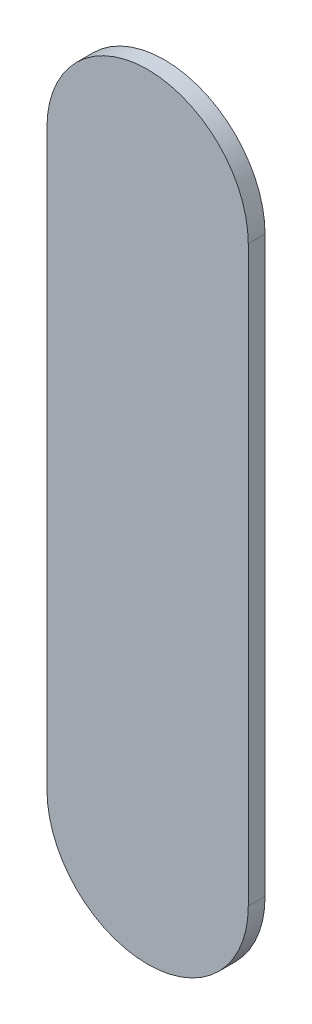
ISO-10303-21;
HEADER;
FILE_DESCRIPTION(('STEP AP214'),'2;1');
FILE_NAME('part.step','',(''),(''),'','','');
FILE_SCHEMA(('AUTOMOTIVE_DESIGN { 1 0 10303 214 1 1 1 1 }'));
ENDSEC;
DATA;
#1=APPLICATION_CONTEXT('core data for automotive mechanical design processes');
#2=APPLICATION_PROTOCOL_DEFINITION('international standard','automotive_design',2000,#1);
#3=PRODUCT_CONTEXT('',#1,'mechanical');
#4=PRODUCT('Part','Part','',(#3));
#5=PRODUCT_RELATED_PRODUCT_CATEGORY('part','',(#4));
#6=PRODUCT_DEFINITION_FORMATION('','',#4);
#7=PRODUCT_DEFINITION_CONTEXT('part definition',#1,'design');
#8=PRODUCT_DEFINITION('design','',#6,#7);
#9=PRODUCT_DEFINITION_SHAPE('','',#8);
#10=(LENGTH_UNIT() NAMED_UNIT(*) SI_UNIT(.MILLI.,.METRE.));
#11=(NAMED_UNIT(*) PLANE_ANGLE_UNIT() SI_UNIT($,.RADIAN.));
#12=(NAMED_UNIT(*) SI_UNIT($,.STERADIAN.) SOLID_ANGLE_UNIT());
#13=UNCERTAINTY_MEASURE_WITH_UNIT(LENGTH_MEASURE(1.E-05),#10,'distance_accuracy_value','');
#14=(GEOMETRIC_REPRESENTATION_CONTEXT(3) GLOBAL_UNCERTAINTY_ASSIGNED_CONTEXT((#13)) GLOBAL_UNIT_ASSIGNED_CONTEXT((#10,
#11,#12)) REPRESENTATION_CONTEXT('',''));
#15=CARTESIAN_POINT('',(0.,0.,0.));
#16=DIRECTION('',(0.,0.,1.));
#17=DIRECTION('',(1.,0.,0.));
#18=AXIS2_PLACEMENT_3D('',#15,#16,#17);
#19=CARTESIAN_POINT('',(45.106999511719,46.530148925781,1.1596000001));
#20=DIRECTION('',(0.,0.,1.));
#21=DIRECTION('',(1.,0.,0.));
#22=AXIS2_PLACEMENT_3D('',#19,#20,#21);
#23=PLANE('',#22);
#24=DIRECTION('',(0.,1.,0.));
#25=VECTOR('',#24,1.);
#26=CARTESIAN_POINT('',(45.03080078125,46.312998046875,1.1596000001));
#27=LINE('',#26,#25);
#28=CARTESIAN_POINT('',(45.03080078125,46.312995605469,1.1596000001));
#29=VERTEX_POINT('',#28);
#30=CARTESIAN_POINT('',(45.03080078125,46.747301025391,1.1596000001));
#31=VERTEX_POINT('',#30);
#32=EDGE_CURVE('E82',#29,#31,#27,.T.);
#33=ORIENTED_EDGE('',*,*,#32,.T.);
#34=CARTESIAN_POINT('',(45.106999511719,46.747302246094,1.1596000001));
#35=DIRECTION('',(0.,0.,1.));
#36=DIRECTION('',(1.,0.,0.));
#37=AXIS2_PLACEMENT_3D('',#34,#35,#36);
#38=CIRCLE('',#37,0.07619873050786);
#39=CARTESIAN_POINT('',(45.183198242207,46.747302246094,1.1596000001));
#40=VERTEX_POINT('',#39);
#41=EDGE_CURVE('E77',#40,#31,#38,.T.);
#42=ORIENTED_EDGE('',*,*,#41,.F.);
#43=DIRECTION('',(0.,-1.,0.));
#44=VECTOR('',#43,1.);
#45=CARTESIAN_POINT('',(45.183198242188,46.747299804688,1.1596000001));
#46=LINE('',#45,#44);
#47=CARTESIAN_POINT('',(45.183198242188,46.312996826172,1.1596000001));
#48=VERTEX_POINT('',#47);
#49=EDGE_CURVE('E26',#40,#48,#46,.T.);
#50=ORIENTED_EDGE('',*,*,#49,.T.);
#51=CARTESIAN_POINT('',(45.106999511719,46.312995605469,1.1596000001));
#52=DIRECTION('',(0.,0.,1.));
#53=DIRECTION('',(1.,0.,0.));
#54=AXIS2_PLACEMENT_3D('',#51,#52,#53);
#55=CIRCLE('',#54,0.07619873050786);
#56=EDGE_CURVE('E11',#29,#48,#55,.T.);
#57=ORIENTED_EDGE('',*,*,#56,.F.);
#58=EDGE_LOOP('',(#33,#42,#50,#57));
#59=FACE_BOUND('',#58,.T.);
#60=ADVANCED_FACE('F17',(#59),#23,.F.);
#61=CARTESIAN_POINT('',(45.106999511719,46.312995605469,1.1596000001));
#62=DIRECTION('',(0.,0.,1.));
#63=DIRECTION('',(1.,0.,0.));
#64=AXIS2_PLACEMENT_3D('',#61,#62,#63);
#65=CYLINDRICAL_SURFACE('',#64,0.07619873050786);
#66=DIRECTION('',(0.,0.,1.));
#67=VECTOR('',#66,1.);
#68=CARTESIAN_POINT('',(45.183198242188,46.312998046875,1.1596000001));
#69=LINE('',#68,#67);
#70=CARTESIAN_POINT('',(45.183198242188,46.312996826172,1.1723000001));
#71=VERTEX_POINT('',#70);
#72=EDGE_CURVE('E141',#48,#71,#69,.T.);
#73=ORIENTED_EDGE('',*,*,#72,.T.);
#74=CARTESIAN_POINT('',(45.106999511719,46.312995605469,1.1723000001));
#75=DIRECTION('',(0.,0.,1.));
#76=DIRECTION('',(1.,0.,0.));
#77=AXIS2_PLACEMENT_3D('',#74,#75,#76);
#78=CIRCLE('',#77,0.07619873050786);
#79=CARTESIAN_POINT('',(45.03080078125,46.312995605469,1.1723000001));
#80=VERTEX_POINT('',#79);
#81=EDGE_CURVE('E93',#80,#71,#78,.T.);
#82=ORIENTED_EDGE('',*,*,#81,.F.);
#83=DIRECTION('',(0.,0.,-1.));
#84=VECTOR('',#83,1.);
#85=CARTESIAN_POINT('',(45.03080078125,46.312995605469,1.1596000001));
#86=LINE('',#85,#84);
#87=EDGE_CURVE('E88',#80,#29,#86,.T.);
#88=ORIENTED_EDGE('',*,*,#87,.T.);
#89=ORIENTED_EDGE('',*,*,#56,.T.);
#90=EDGE_LOOP('',(#73,#82,#88,#89));
#91=FACE_BOUND('',#90,.T.);
#92=ADVANCED_FACE('F184',(#91),#65,.T.);
#93=CARTESIAN_POINT('',(45.183198242188,46.747299804688,1.1596000001));
#94=DIRECTION('',(-1.,0.,0.));
#95=DIRECTION('',(0.,0.,1.));
#96=AXIS2_PLACEMENT_3D('',#93,#94,#95);
#97=PLANE('',#96);
#98=ORIENTED_EDGE('',*,*,#72,.F.);
#99=ORIENTED_EDGE('',*,*,#49,.F.);
#100=DIRECTION('',(0.,0.,-1.));
#101=VECTOR('',#100,1.);
#102=CARTESIAN_POINT('',(45.183198242227,46.747302246094,1.1596000001));
#103=LINE('',#102,#101);
#104=CARTESIAN_POINT('',(45.183198242207,46.747302246094,1.1723000001));
#105=VERTEX_POINT('',#104);
#106=EDGE_CURVE('E66',#105,#40,#103,.T.);
#107=ORIENTED_EDGE('',*,*,#106,.F.);
#108=DIRECTION('',(0.,1.,0.));
#109=VECTOR('',#108,1.);
#110=CARTESIAN_POINT('',(45.183198242188,46.530148925781,1.1723000001));
#111=LINE('',#110,#109);
#112=EDGE_CURVE('E83',#71,#105,#111,.T.);
#113=ORIENTED_EDGE('',*,*,#112,.F.);
#114=EDGE_LOOP('',(#98,#99,#107,#113));
#115=FACE_BOUND('',#114,.T.);
#116=ADVANCED_FACE('F176',(#115),#97,.F.);
#117=CARTESIAN_POINT('',(45.106999511719,46.747302246094,1.1596000001));
#118=DIRECTION('',(0.,0.,1.));
#119=DIRECTION('',(1.,0.,0.));
#120=AXIS2_PLACEMENT_3D('',#117,#118,#119);
#121=CYLINDRICAL_SURFACE('',#120,0.07619873050786);
#122=DIRECTION('',(0.,0.,1.));
#123=VECTOR('',#122,1.);
#124=CARTESIAN_POINT('',(45.03080078125,46.747299804688,1.1596000001));
#125=LINE('',#124,#123);
#126=CARTESIAN_POINT('',(45.03080078125,46.747301025391,1.1723000001));
#127=VERTEX_POINT('',#126);
#128=EDGE_CURVE('E73',#31,#127,#125,.T.);
#129=ORIENTED_EDGE('',*,*,#128,.T.);
#130=CARTESIAN_POINT('',(45.106999511719,46.747302246094,1.1723000001));
#131=DIRECTION('',(0.,0.,1.));
#132=DIRECTION('',(1.,0.,0.));
#133=AXIS2_PLACEMENT_3D('',#130,#131,#132);
#134=CIRCLE('',#133,0.07619873050786);
#135=EDGE_CURVE('E20',#105,#127,#134,.T.);
#136=ORIENTED_EDGE('',*,*,#135,.F.);
#137=ORIENTED_EDGE('',*,*,#106,.T.);
#138=ORIENTED_EDGE('',*,*,#41,.T.);
#139=EDGE_LOOP('',(#129,#136,#137,#138));
#140=FACE_BOUND('',#139,.T.);
#141=ADVANCED_FACE('F75',(#140),#121,.T.);
#142=CARTESIAN_POINT('',(45.03080078125,46.312998046875,1.1596000001));
#143=DIRECTION('',(1.,0.,0.));
#144=DIRECTION('',(0.,1.,0.));
#145=AXIS2_PLACEMENT_3D('',#142,#143,#144);
#146=PLANE('',#145);
#147=ORIENTED_EDGE('',*,*,#128,.F.);
#148=ORIENTED_EDGE('',*,*,#32,.F.);
#149=ORIENTED_EDGE('',*,*,#87,.F.);
#150=DIRECTION('',(0.,-1.,0.));
#151=VECTOR('',#150,1.);
#152=CARTESIAN_POINT('',(45.03080078125,46.530148925781,1.1723000001));
#153=LINE('',#152,#151);
#154=EDGE_CURVE('E86',#127,#80,#153,.T.);
#155=ORIENTED_EDGE('',*,*,#154,.F.);
#156=EDGE_LOOP('',(#147,#148,#149,#155));
#157=FACE_BOUND('',#156,.T.);
#158=ADVANCED_FACE('F87',(#157),#146,.F.);
#159=CARTESIAN_POINT('',(45.106999511719,46.530148925781,1.1723000001));
#160=DIRECTION('',(0.,0.,1.));
#161=DIRECTION('',(1.,0.,0.));
#162=AXIS2_PLACEMENT_3D('',#159,#160,#161);
#163=PLANE('',#162);
#164=ORIENTED_EDGE('',*,*,#135,.T.);
#165=ORIENTED_EDGE('',*,*,#154,.T.);
#166=ORIENTED_EDGE('',*,*,#81,.T.);
#167=ORIENTED_EDGE('',*,*,#112,.T.);
#168=EDGE_LOOP('',(#164,#165,#166,#167));
#169=FACE_BOUND('',#168,.T.);
#170=ADVANCED_FACE('F95',(#169),#163,.T.);
#171=CLOSED_SHELL('',(#60,#92,#116,#141,#158,#170));
#172=MANIFOLD_SOLID_BREP('B1',#171);
#173=ADVANCED_BREP_SHAPE_REPRESENTATION('',(#18,#172),#14);
#174=SHAPE_DEFINITION_REPRESENTATION(#9,#173);
ENDSEC;
END-ISO-10303-21;
